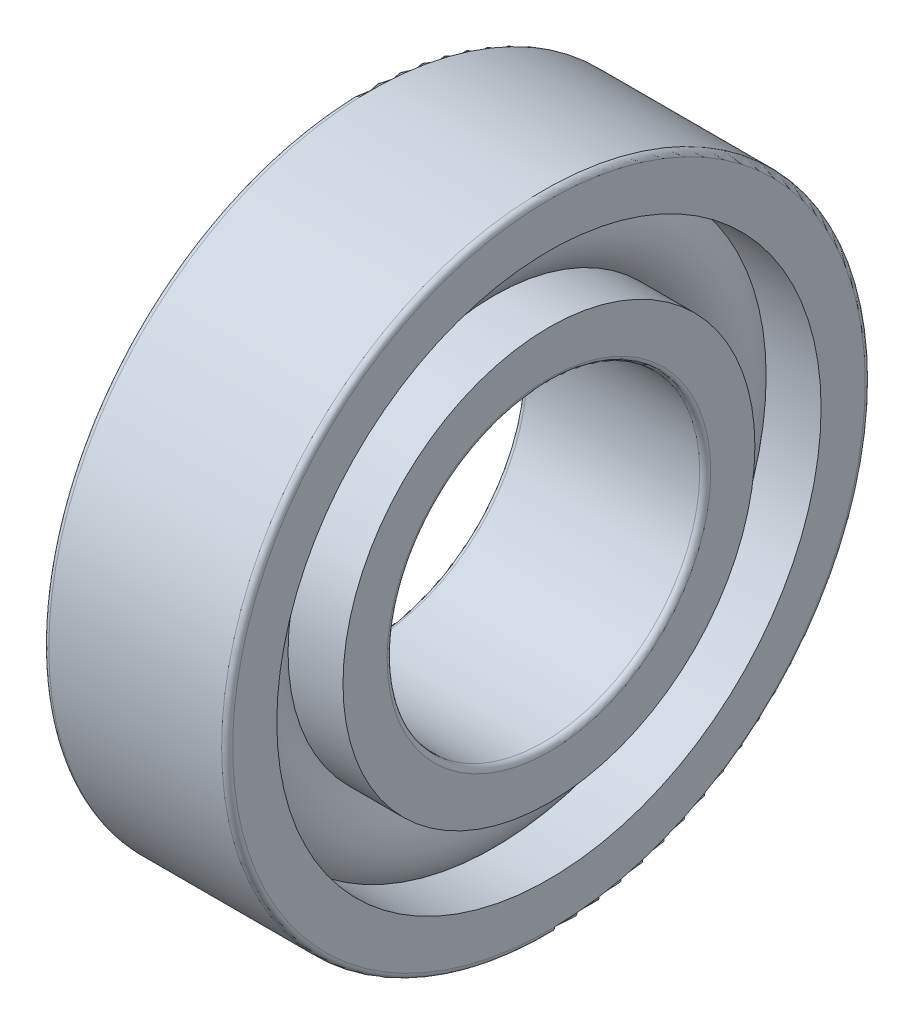
ISO-10303-21;
HEADER;
FILE_DESCRIPTION(('STEP AP214'),'2;1');
FILE_NAME('part.step','',(''),(''),'','','');
FILE_SCHEMA(('AUTOMOTIVE_DESIGN { 1 0 10303 214 1 1 1 1 }'));
ENDSEC;
DATA;
#1=APPLICATION_CONTEXT('core data for automotive mechanical design processes');
#2=APPLICATION_PROTOCOL_DEFINITION('international standard','automotive_design',2000,#1);
#3=PRODUCT_CONTEXT('',#1,'mechanical');
#4=PRODUCT('Part','Part','',(#3));
#5=PRODUCT_RELATED_PRODUCT_CATEGORY('part','',(#4));
#6=PRODUCT_DEFINITION_FORMATION('','',#4);
#7=PRODUCT_DEFINITION_CONTEXT('part definition',#1,'design');
#8=PRODUCT_DEFINITION('design','',#6,#7);
#9=PRODUCT_DEFINITION_SHAPE('','',#8);
#10=(LENGTH_UNIT() NAMED_UNIT(*) SI_UNIT(.MILLI.,.METRE.));
#11=(NAMED_UNIT(*) PLANE_ANGLE_UNIT() SI_UNIT($,.RADIAN.));
#12=(NAMED_UNIT(*) SI_UNIT($,.STERADIAN.) SOLID_ANGLE_UNIT());
#13=UNCERTAINTY_MEASURE_WITH_UNIT(LENGTH_MEASURE(1.E-05),#10,'distance_accuracy_value','');
#14=(GEOMETRIC_REPRESENTATION_CONTEXT(3) GLOBAL_UNCERTAINTY_ASSIGNED_CONTEXT((#13)) GLOBAL_UNIT_ASSIGNED_CONTEXT((#10,
#11,#12)) REPRESENTATION_CONTEXT('',''));
#15=CARTESIAN_POINT('',(0.,0.,0.));
#16=DIRECTION('',(0.,0.,1.));
#17=DIRECTION('',(1.,0.,0.));
#18=AXIS2_PLACEMENT_3D('',#15,#16,#17);
#19=CARTESIAN_POINT('',(0.,0.,0.));
#20=DIRECTION('',(-1.,0.,0.));
#21=DIRECTION('',(0.,0.,1.));
#22=AXIS2_PLACEMENT_3D('',#19,#20,#21);
#23=TOROIDAL_SURFACE('',#22,13.,2.7);
#24=CARTESIAN_POINT('',(2.01246117974981,0.,0.));
#25=DIRECTION('',(-1.,0.,0.));
#26=DIRECTION('',(0.,0.,1.));
#27=AXIS2_PLACEMENT_3D('',#24,#25,#26);
#28=CIRCLE('',#27,14.8);
#29=CARTESIAN_POINT('',(2.01246117974981,0.,14.8));
#30=VERTEX_POINT('',#29);
#31=EDGE_CURVE('E37',#30,#30,#28,.F.);
#32=ORIENTED_EDGE('',*,*,#31,.T.);
#33=EDGE_LOOP('',(#32));
#34=FACE_BOUND('',#33,.T.);
#35=CARTESIAN_POINT('',(2.01246117974981,0.,0.));
#36=DIRECTION('',(-1.,0.,0.));
#37=DIRECTION('',(0.,0.,1.));
#38=AXIS2_PLACEMENT_3D('',#35,#36,#37);
#39=CIRCLE('',#38,11.2);
#40=CARTESIAN_POINT('',(2.01246117974981,0.,11.2));
#41=VERTEX_POINT('',#40);
#42=EDGE_CURVE('E10',#41,#41,#39,.T.);
#43=ORIENTED_EDGE('',*,*,#42,.T.);
#44=EDGE_LOOP('',(#43));
#45=FACE_BOUND('',#44,.T.);
#46=ADVANCED_FACE('F33',(#34,#45),#23,.T.);
#47=CARTESIAN_POINT('',(-20.6375,0.,0.));
#48=DIRECTION('',(1.,0.,0.));
#49=DIRECTION('',(0.,0.,-1.));
#50=AXIS2_PLACEMENT_3D('',#47,#48,#49);
#51=CYLINDRICAL_SURFACE('',#50,11.2);
#52=CARTESIAN_POINT('',(5.,0.,0.));
#53=DIRECTION('',(1.,0.,0.));
#54=DIRECTION('',(0.,0.,-1.));
#55=AXIS2_PLACEMENT_3D('',#52,#53,#54);
#56=CIRCLE('',#55,11.2);
#57=CARTESIAN_POINT('',(5.,0.,-11.2));
#58=VERTEX_POINT('',#57);
#59=EDGE_CURVE('E46',#58,#58,#56,.T.);
#60=ORIENTED_EDGE('',*,*,#59,.F.);
#61=EDGE_LOOP('',(#60));
#62=FACE_BOUND('',#61,.T.);
#63=ORIENTED_EDGE('',*,*,#42,.F.);
#64=EDGE_LOOP('',(#63));
#65=FACE_BOUND('',#64,.T.);
#66=ADVANCED_FACE('F85',(#62,#65),#51,.T.);
#67=CARTESIAN_POINT('',(-20.6375,0.,0.));
#68=DIRECTION('',(1.,0.,0.));
#69=DIRECTION('',(0.,0.,-1.));
#70=AXIS2_PLACEMENT_3D('',#67,#68,#69);
#71=CYLINDRICAL_SURFACE('',#70,11.2);
#72=CARTESIAN_POINT('',(-5.,0.,0.));
#73=DIRECTION('',(1.,0.,0.));
#74=DIRECTION('',(0.,0.,-1.));
#75=AXIS2_PLACEMENT_3D('',#72,#73,#74);
#76=CIRCLE('',#75,11.2);
#77=CARTESIAN_POINT('',(-5.,0.,-11.2));
#78=VERTEX_POINT('',#77);
#79=EDGE_CURVE('E55',#78,#78,#76,.T.);
#80=ORIENTED_EDGE('',*,*,#79,.T.);
#81=EDGE_LOOP('',(#80));
#82=FACE_BOUND('',#81,.T.);
#83=CARTESIAN_POINT('',(-2.01246117974981,0.,0.));
#84=DIRECTION('',(1.,0.,0.));
#85=DIRECTION('',(0.,0.,-1.));
#86=AXIS2_PLACEMENT_3D('',#83,#84,#85);
#87=CIRCLE('',#86,11.2);
#88=CARTESIAN_POINT('',(-2.01246117974981,0.,-11.2));
#89=VERTEX_POINT('',#88);
#90=EDGE_CURVE('E41',#89,#89,#87,.T.);
#91=ORIENTED_EDGE('',*,*,#90,.F.);
#92=EDGE_LOOP('',(#91));
#93=FACE_BOUND('',#92,.T.);
#94=ADVANCED_FACE('F88',(#82,#93),#71,.T.);
#95=CARTESIAN_POINT('',(5.,8.8,0.));
#96=DIRECTION('',(1.,0.,0.));
#97=DIRECTION('',(0.,0.,-1.));
#98=AXIS2_PLACEMENT_3D('',#95,#96,#97);
#99=PLANE('',#98);
#100=ORIENTED_EDGE('',*,*,#59,.T.);
#101=EDGE_LOOP('',(#100));
#102=FACE_BOUND('',#101,.T.);
#103=CARTESIAN_POINT('',(5.,0.,0.));
#104=DIRECTION('',(1.,0.,0.));
#105=DIRECTION('',(0.,0.,-1.));
#106=AXIS2_PLACEMENT_3D('',#103,#104,#105);
#107=CIRCLE('',#106,8.8);
#108=CARTESIAN_POINT('',(5.,0.,-8.8));
#109=VERTEX_POINT('',#108);
#110=EDGE_CURVE('E77',#109,#109,#107,.T.);
#111=ORIENTED_EDGE('',*,*,#110,.F.);
#112=EDGE_LOOP('',(#111));
#113=FACE_BOUND('',#112,.T.);
#114=ADVANCED_FACE('F82',(#102,#113),#99,.T.);
#115=CARTESIAN_POINT('',(4.7,0.,0.));
#116=DIRECTION('',(1.,0.,0.));
#117=DIRECTION('',(0.,0.,-1.));
#118=AXIS2_PLACEMENT_3D('',#115,#116,#117);
#119=TOROIDAL_SURFACE('',#118,8.8,0.3);
#120=ORIENTED_EDGE('',*,*,#110,.T.);
#121=EDGE_LOOP('',(#120));
#122=FACE_BOUND('',#121,.T.);
#123=CARTESIAN_POINT('',(4.7,0.,0.));
#124=DIRECTION('',(1.,0.,0.));
#125=DIRECTION('',(0.,0.,-1.));
#126=AXIS2_PLACEMENT_3D('',#123,#124,#125);
#127=CIRCLE('',#126,8.5);
#128=CARTESIAN_POINT('',(4.7,0.,-8.5));
#129=VERTEX_POINT('',#128);
#130=EDGE_CURVE('E74',#129,#129,#127,.T.);
#131=ORIENTED_EDGE('',*,*,#130,.F.);
#132=EDGE_LOOP('',(#131));
#133=FACE_BOUND('',#132,.T.);
#134=ADVANCED_FACE('F99',(#122,#133),#119,.T.);
#135=CARTESIAN_POINT('',(-20.6375,0.,0.));
#136=DIRECTION('',(1.,0.,0.));
#137=DIRECTION('',(0.,0.,-1.));
#138=AXIS2_PLACEMENT_3D('',#135,#136,#137);
#139=CYLINDRICAL_SURFACE('',#138,8.5);
#140=ORIENTED_EDGE('',*,*,#130,.T.);
#141=EDGE_LOOP('',(#140));
#142=FACE_BOUND('',#141,.T.);
#143=CARTESIAN_POINT('',(-4.7,0.,0.));
#144=DIRECTION('',(1.,0.,0.));
#145=DIRECTION('',(0.,0.,-1.));
#146=AXIS2_PLACEMENT_3D('',#143,#144,#145);
#147=CIRCLE('',#146,8.5);
#148=CARTESIAN_POINT('',(-4.7,0.,-8.5));
#149=VERTEX_POINT('',#148);
#150=EDGE_CURVE('E71',#149,#149,#147,.T.);
#151=ORIENTED_EDGE('',*,*,#150,.F.);
#152=EDGE_LOOP('',(#151));
#153=FACE_BOUND('',#152,.T.);
#154=ADVANCED_FACE('F102',(#142,#153),#139,.F.);
#155=CARTESIAN_POINT('',(-4.7,0.,0.));
#156=DIRECTION('',(1.,0.,0.));
#157=DIRECTION('',(0.,0.,-1.));
#158=AXIS2_PLACEMENT_3D('',#155,#156,#157);
#159=TOROIDAL_SURFACE('',#158,8.8,0.3);
#160=ORIENTED_EDGE('',*,*,#150,.T.);
#161=EDGE_LOOP('',(#160));
#162=FACE_BOUND('',#161,.T.);
#163=CARTESIAN_POINT('',(-5.,0.,0.));
#164=DIRECTION('',(1.,0.,0.));
#165=DIRECTION('',(0.,0.,-1.));
#166=AXIS2_PLACEMENT_3D('',#163,#164,#165);
#167=CIRCLE('',#166,8.8);
#168=CARTESIAN_POINT('',(-5.,0.,-8.8));
#169=VERTEX_POINT('',#168);
#170=EDGE_CURVE('E68',#169,#169,#167,.T.);
#171=ORIENTED_EDGE('',*,*,#170,.F.);
#172=EDGE_LOOP('',(#171));
#173=FACE_BOUND('',#172,.T.);
#174=ADVANCED_FACE('F106',(#162,#173),#159,.T.);
#175=CARTESIAN_POINT('',(-5.,11.2,0.));
#176=DIRECTION('',(-1.,0.,0.));
#177=DIRECTION('',(0.,0.,1.));
#178=AXIS2_PLACEMENT_3D('',#175,#176,#177);
#179=PLANE('',#178);
#180=ORIENTED_EDGE('',*,*,#170,.T.);
#181=EDGE_LOOP('',(#180));
#182=FACE_BOUND('',#181,.T.);
#183=ORIENTED_EDGE('',*,*,#79,.F.);
#184=EDGE_LOOP('',(#183));
#185=FACE_BOUND('',#184,.T.);
#186=ADVANCED_FACE('F110',(#182,#185),#179,.T.);
#187=CARTESIAN_POINT('',(-2.01246117974981,0.,0.));
#188=DIRECTION('',(1.,0.,0.));
#189=DIRECTION('',(0.,0.,-1.));
#190=AXIS2_PLACEMENT_3D('',#187,#188,#189);
#191=CIRCLE('',#190,14.8);
#192=CARTESIAN_POINT('',(-2.01246117974981,0.,-14.8));
#193=VERTEX_POINT('',#192);
#194=EDGE_CURVE('E49',#193,#193,#191,.F.);
#195=ORIENTED_EDGE('',*,*,#194,.T.);
#196=EDGE_LOOP('',(#195));
#197=FACE_BOUND('',#196,.T.);
#198=ORIENTED_EDGE('',*,*,#90,.T.);
#199=EDGE_LOOP('',(#198));
#200=FACE_BOUND('',#199,.T.);
#201=ADVANCED_FACE('F35',(#197,#200),#23,.T.);
#202=CARTESIAN_POINT('',(-20.6375,0.,0.));
#203=DIRECTION('',(1.,0.,0.));
#204=DIRECTION('',(0.,0.,-1.));
#205=AXIS2_PLACEMENT_3D('',#202,#203,#204);
#206=CYLINDRICAL_SURFACE('',#205,14.8);
#207=CARTESIAN_POINT('',(5.,0.,0.));
#208=DIRECTION('',(1.,0.,0.));
#209=DIRECTION('',(0.,0.,-1.));
#210=AXIS2_PLACEMENT_3D('',#207,#208,#209);
#211=CIRCLE('',#210,14.8);
#212=CARTESIAN_POINT('',(5.,0.,-14.8));
#213=VERTEX_POINT('',#212);
#214=EDGE_CURVE('E51',#213,#213,#211,.T.);
#215=ORIENTED_EDGE('',*,*,#214,.T.);
#216=EDGE_LOOP('',(#215));
#217=FACE_BOUND('',#216,.T.);
#218=ORIENTED_EDGE('',*,*,#31,.F.);
#219=EDGE_LOOP('',(#218));
#220=FACE_BOUND('',#219,.T.);
#221=ADVANCED_FACE('F115',(#217,#220),#206,.F.);
#222=CARTESIAN_POINT('',(-20.6375,0.,0.));
#223=DIRECTION('',(1.,0.,0.));
#224=DIRECTION('',(0.,0.,-1.));
#225=AXIS2_PLACEMENT_3D('',#222,#223,#224);
#226=CYLINDRICAL_SURFACE('',#225,14.8);
#227=CARTESIAN_POINT('',(-5.,0.,0.));
#228=DIRECTION('',(1.,0.,0.));
#229=DIRECTION('',(0.,0.,-1.));
#230=AXIS2_PLACEMENT_3D('',#227,#228,#229);
#231=CIRCLE('',#230,14.8);
#232=CARTESIAN_POINT('',(-5.,0.,-14.8));
#233=VERTEX_POINT('',#232);
#234=EDGE_CURVE('E146',#233,#233,#231,.T.);
#235=ORIENTED_EDGE('',*,*,#234,.F.);
#236=EDGE_LOOP('',(#235));
#237=FACE_BOUND('',#236,.T.);
#238=ORIENTED_EDGE('',*,*,#194,.F.);
#239=EDGE_LOOP('',(#238));
#240=FACE_BOUND('',#239,.T.);
#241=ADVANCED_FACE('F118',(#237,#240),#226,.F.);
#242=CARTESIAN_POINT('',(5.,17.2,0.));
#243=DIRECTION('',(1.,0.,0.));
#244=DIRECTION('',(0.,0.,-1.));
#245=AXIS2_PLACEMENT_3D('',#242,#243,#244);
#246=PLANE('',#245);
#247=CARTESIAN_POINT('',(5.,0.,0.));
#248=DIRECTION('',(1.,0.,0.));
#249=DIRECTION('',(0.,0.,-1.));
#250=AXIS2_PLACEMENT_3D('',#247,#248,#249);
#251=CIRCLE('',#250,17.2);
#252=CARTESIAN_POINT('',(5.,0.,-17.2));
#253=VERTEX_POINT('',#252);
#254=EDGE_CURVE('E57',#253,#253,#251,.T.);
#255=ORIENTED_EDGE('',*,*,#254,.T.);
#256=EDGE_LOOP('',(#255));
#257=FACE_BOUND('',#256,.T.);
#258=ORIENTED_EDGE('',*,*,#214,.F.);
#259=EDGE_LOOP('',(#258));
#260=FACE_BOUND('',#259,.T.);
#261=ADVANCED_FACE('F119',(#257,#260),#246,.T.);
#262=CARTESIAN_POINT('',(4.7,0.,0.));
#263=DIRECTION('',(1.,0.,0.));
#264=DIRECTION('',(0.,0.,-1.));
#265=AXIS2_PLACEMENT_3D('',#262,#263,#264);
#266=TOROIDAL_SURFACE('',#265,17.2,0.299999999999999);
#267=CARTESIAN_POINT('',(4.7,0.,0.));
#268=DIRECTION('',(1.,0.,0.));
#269=DIRECTION('',(0.,0.,-1.));
#270=AXIS2_PLACEMENT_3D('',#267,#268,#269);
#271=CIRCLE('',#270,17.5);
#272=CARTESIAN_POINT('',(4.7,0.,-17.5));
#273=VERTEX_POINT('',#272);
#274=EDGE_CURVE('E62',#273,#273,#271,.T.);
#275=ORIENTED_EDGE('',*,*,#274,.T.);
#276=EDGE_LOOP('',(#275));
#277=FACE_BOUND('',#276,.T.);
#278=ORIENTED_EDGE('',*,*,#254,.F.);
#279=EDGE_LOOP('',(#278));
#280=FACE_BOUND('',#279,.T.);
#281=ADVANCED_FACE('F122',(#277,#280),#266,.T.);
#282=CARTESIAN_POINT('',(-20.6375,0.,0.));
#283=DIRECTION('',(1.,0.,0.));
#284=DIRECTION('',(0.,0.,-1.));
#285=AXIS2_PLACEMENT_3D('',#282,#283,#284);
#286=CYLINDRICAL_SURFACE('',#285,17.5);
#287=CARTESIAN_POINT('',(-4.7,0.,0.));
#288=DIRECTION('',(1.,0.,0.));
#289=DIRECTION('',(0.,0.,-1.));
#290=AXIS2_PLACEMENT_3D('',#287,#288,#289);
#291=CIRCLE('',#290,17.5);
#292=CARTESIAN_POINT('',(-4.7,0.,-17.5));
#293=VERTEX_POINT('',#292);
#294=EDGE_CURVE('E150',#293,#293,#291,.T.);
#295=ORIENTED_EDGE('',*,*,#294,.T.);
#296=EDGE_LOOP('',(#295));
#297=FACE_BOUND('',#296,.T.);
#298=ORIENTED_EDGE('',*,*,#274,.F.);
#299=EDGE_LOOP('',(#298));
#300=FACE_BOUND('',#299,.T.);
#301=ADVANCED_FACE('F126',(#297,#300),#286,.T.);
#302=CARTESIAN_POINT('',(-4.7,0.,0.));
#303=DIRECTION('',(1.,0.,0.));
#304=DIRECTION('',(0.,0.,-1.));
#305=AXIS2_PLACEMENT_3D('',#302,#303,#304);
#306=TOROIDAL_SURFACE('',#305,17.2,0.299999999999999);
#307=CARTESIAN_POINT('',(-5.,0.,0.));
#308=DIRECTION('',(1.,0.,0.));
#309=DIRECTION('',(0.,0.,-1.));
#310=AXIS2_PLACEMENT_3D('',#307,#308,#309);
#311=CIRCLE('',#310,17.2);
#312=CARTESIAN_POINT('',(-5.,0.,-17.2));
#313=VERTEX_POINT('',#312);
#314=EDGE_CURVE('E147',#313,#313,#311,.T.);
#315=ORIENTED_EDGE('',*,*,#314,.T.);
#316=EDGE_LOOP('',(#315));
#317=FACE_BOUND('',#316,.T.);
#318=ORIENTED_EDGE('',*,*,#294,.F.);
#319=EDGE_LOOP('',(#318));
#320=FACE_BOUND('',#319,.T.);
#321=ADVANCED_FACE('F130',(#317,#320),#306,.T.);
#322=CARTESIAN_POINT('',(-5.,14.8,0.));
#323=DIRECTION('',(-1.,0.,0.));
#324=DIRECTION('',(0.,0.,1.));
#325=AXIS2_PLACEMENT_3D('',#322,#323,#324);
#326=PLANE('',#325);
#327=ORIENTED_EDGE('',*,*,#234,.T.);
#328=EDGE_LOOP('',(#327));
#329=FACE_BOUND('',#328,.T.);
#330=ORIENTED_EDGE('',*,*,#314,.F.);
#331=EDGE_LOOP('',(#330));
#332=FACE_BOUND('',#331,.T.);
#333=ADVANCED_FACE('F134',(#329,#332),#326,.T.);
#334=CLOSED_SHELL('',(#46,#66,#94,#114,#134,#154,#174,#186,#201,#221,#241,#261,#281,#301,#321,#333));
#335=MANIFOLD_SOLID_BREP('B2',#334);
#336=ADVANCED_BREP_SHAPE_REPRESENTATION('',(#18,#335),#14);
#337=SHAPE_DEFINITION_REPRESENTATION(#9,#336);
ENDSEC;
END-ISO-10303-21;
